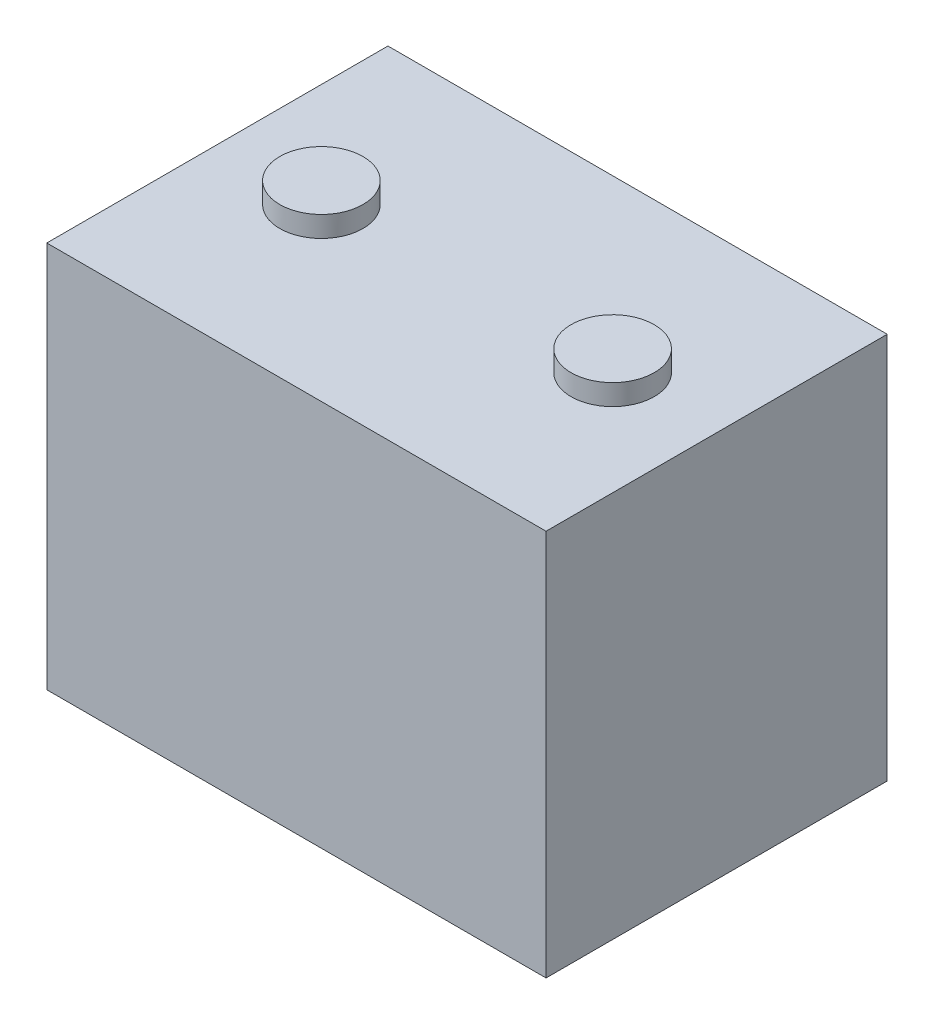
ISO-10303-21;
HEADER;
FILE_DESCRIPTION(('STEP AP214'),'2;1');
FILE_NAME('part.step','',(''),(''),'','','');
FILE_SCHEMA(('AUTOMOTIVE_DESIGN { 1 0 10303 214 1 1 1 1 }'));
ENDSEC;
DATA;
#1=APPLICATION_CONTEXT('core data for automotive mechanical design processes');
#2=APPLICATION_PROTOCOL_DEFINITION('international standard','automotive_design',2000,#1);
#3=PRODUCT_CONTEXT('',#1,'mechanical');
#4=PRODUCT('Part','Part','',(#3));
#5=PRODUCT_RELATED_PRODUCT_CATEGORY('part','',(#4));
#6=PRODUCT_DEFINITION_FORMATION('','',#4);
#7=PRODUCT_DEFINITION_CONTEXT('part definition',#1,'design');
#8=PRODUCT_DEFINITION('design','',#6,#7);
#9=PRODUCT_DEFINITION_SHAPE('','',#8);
#10=(LENGTH_UNIT() NAMED_UNIT(*) SI_UNIT(.MILLI.,.METRE.));
#11=(NAMED_UNIT(*) PLANE_ANGLE_UNIT() SI_UNIT($,.RADIAN.));
#12=(NAMED_UNIT(*) SI_UNIT($,.STERADIAN.) SOLID_ANGLE_UNIT());
#13=UNCERTAINTY_MEASURE_WITH_UNIT(LENGTH_MEASURE(1.E-05),#10,'distance_accuracy_value','');
#14=(GEOMETRIC_REPRESENTATION_CONTEXT(3) GLOBAL_UNCERTAINTY_ASSIGNED_CONTEXT((#13)) GLOBAL_UNIT_ASSIGNED_CONTEXT((#10,
#11,#12)) REPRESENTATION_CONTEXT('',''));
#15=CARTESIAN_POINT('',(0.,0.,0.));
#16=DIRECTION('',(0.,0.,1.));
#17=DIRECTION('',(1.,0.,0.));
#18=AXIS2_PLACEMENT_3D('',#15,#16,#17);
#19=CARTESIAN_POINT('',(32.4166666666667,66.75,82.));
#20=DIRECTION('',(-1.,0.,0.));
#21=DIRECTION('',(0.,-1.,0.));
#22=AXIS2_PLACEMENT_3D('',#19,#20,#21);
#23=PLANE('',#22);
#24=DIRECTION('',(0.,1.,0.));
#25=VECTOR('',#24,1.);
#26=CARTESIAN_POINT('',(32.4166666666667,66.75,0.));
#27=LINE('',#26,#25);
#28=CARTESIAN_POINT('',(32.4166666666667,-26.25,0.));
#29=VERTEX_POINT('',#28);
#30=CARTESIAN_POINT('',(32.4166666666667,66.75,0.));
#31=VERTEX_POINT('',#30);
#32=EDGE_CURVE('E100',#29,#31,#27,.T.);
#33=ORIENTED_EDGE('',*,*,#32,.T.);
#34=DIRECTION('',(0.,0.,-1.));
#35=VECTOR('',#34,1.);
#36=CARTESIAN_POINT('',(32.4166666666667,66.75,82.));
#37=LINE('',#36,#35);
#38=CARTESIAN_POINT('',(32.4166666666667,66.75,82.));
#39=VERTEX_POINT('',#38);
#40=EDGE_CURVE('E91',#39,#31,#37,.T.);
#41=ORIENTED_EDGE('',*,*,#40,.F.);
#42=DIRECTION('',(0.,1.,0.));
#43=VECTOR('',#42,1.);
#44=CARTESIAN_POINT('',(32.4166666666667,66.75,82.));
#45=LINE('',#44,#43);
#46=CARTESIAN_POINT('',(32.4166666666667,-26.25,82.));
#47=VERTEX_POINT('',#46);
#48=EDGE_CURVE('E85',#47,#39,#45,.T.);
#49=ORIENTED_EDGE('',*,*,#48,.F.);
#50=DIRECTION('',(0.,0.,-1.));
#51=VECTOR('',#50,1.);
#52=CARTESIAN_POINT('',(32.4166666666667,-26.25,82.));
#53=LINE('',#52,#51);
#54=EDGE_CURVE('E96',#47,#29,#53,.T.);
#55=ORIENTED_EDGE('',*,*,#54,.T.);
#56=EDGE_LOOP('',(#33,#41,#49,#55));
#57=FACE_BOUND('',#56,.T.);
#58=ADVANCED_FACE('F33',(#57),#23,.F.);
#59=CARTESIAN_POINT('',(-87.5833333333333,66.75,82.));
#60=DIRECTION('',(0.,-1.,0.));
#61=DIRECTION('',(0.,0.,-1.));
#62=AXIS2_PLACEMENT_3D('',#59,#60,#61);
#63=PLANE('',#62);
#64=CARTESIAN_POINT('',(7.4166666666667,66.75,41.));
#65=DIRECTION('',(0.,-1.,0.));
#66=DIRECTION('',(0.,0.,-1.));
#67=AXIS2_PLACEMENT_3D('',#64,#65,#66);
#68=CIRCLE('',#67,10.);
#69=CARTESIAN_POINT('',(7.4166666666667,66.75,31.));
#70=VERTEX_POINT('',#69);
#71=EDGE_CURVE('E11',#70,#70,#68,.F.);
#72=ORIENTED_EDGE('',*,*,#71,.F.);
#73=EDGE_LOOP('',(#72));
#74=FACE_BOUND('',#73,.T.);
#75=CARTESIAN_POINT('',(-62.5833333333333,66.75,41.));
#76=DIRECTION('',(0.,-1.,0.));
#77=DIRECTION('',(0.,0.,-1.));
#78=AXIS2_PLACEMENT_3D('',#75,#76,#77);
#79=CIRCLE('',#78,10.);
#80=CARTESIAN_POINT('',(-62.5833333333333,66.75,31.));
#81=VERTEX_POINT('',#80);
#82=EDGE_CURVE('E41',#81,#81,#79,.F.);
#83=ORIENTED_EDGE('',*,*,#82,.F.);
#84=EDGE_LOOP('',(#83));
#85=FACE_BOUND('',#84,.T.);
#86=DIRECTION('',(-1.,0.,0.));
#87=VECTOR('',#86,1.);
#88=CARTESIAN_POINT('',(-87.5833333333333,66.75,0.));
#89=LINE('',#88,#87);
#90=CARTESIAN_POINT('',(-87.5833333333333,66.75,0.));
#91=VERTEX_POINT('',#90);
#92=EDGE_CURVE('E90',#31,#91,#89,.T.);
#93=ORIENTED_EDGE('',*,*,#92,.T.);
#94=DIRECTION('',(0.,0.,-1.));
#95=VECTOR('',#94,1.);
#96=CARTESIAN_POINT('',(-87.5833333333333,66.75,82.));
#97=LINE('',#96,#95);
#98=CARTESIAN_POINT('',(-87.5833333333333,66.75,82.));
#99=VERTEX_POINT('',#98);
#100=EDGE_CURVE('E88',#99,#91,#97,.T.);
#101=ORIENTED_EDGE('',*,*,#100,.F.);
#102=DIRECTION('',(-1.,0.,0.));
#103=VECTOR('',#102,1.);
#104=CARTESIAN_POINT('',(-87.5833333333333,66.75,82.));
#105=LINE('',#104,#103);
#106=EDGE_CURVE('E80',#39,#99,#105,.T.);
#107=ORIENTED_EDGE('',*,*,#106,.F.);
#108=ORIENTED_EDGE('',*,*,#40,.T.);
#109=EDGE_LOOP('',(#93,#101,#107,#108));
#110=FACE_BOUND('',#109,.T.);
#111=ADVANCED_FACE('F89',(#74,#85,#110),#63,.F.);
#112=CARTESIAN_POINT('',(-87.5833333333333,66.75,82.));
#113=DIRECTION('',(1.,0.,0.));
#114=DIRECTION('',(0.,1.,0.));
#115=AXIS2_PLACEMENT_3D('',#112,#113,#114);
#116=PLANE('',#115);
#117=DIRECTION('',(0.,-1.,0.));
#118=VECTOR('',#117,1.);
#119=CARTESIAN_POINT('',(-87.5833333333333,66.75,0.));
#120=LINE('',#119,#118);
#121=CARTESIAN_POINT('',(-87.5833333333333,-26.25,0.));
#122=VERTEX_POINT('',#121);
#123=EDGE_CURVE('E66',#91,#122,#120,.T.);
#124=ORIENTED_EDGE('',*,*,#123,.T.);
#125=DIRECTION('',(0.,0.,-1.));
#126=VECTOR('',#125,1.);
#127=CARTESIAN_POINT('',(-87.5833333333333,-26.25,82.));
#128=LINE('',#127,#126);
#129=CARTESIAN_POINT('',(-87.5833333333333,-26.25,82.));
#130=VERTEX_POINT('',#129);
#131=EDGE_CURVE('E92',#130,#122,#128,.T.);
#132=ORIENTED_EDGE('',*,*,#131,.F.);
#133=DIRECTION('',(0.,-1.,0.));
#134=VECTOR('',#133,1.);
#135=CARTESIAN_POINT('',(-87.5833333333333,66.75,82.));
#136=LINE('',#135,#134);
#137=EDGE_CURVE('E83',#99,#130,#136,.T.);
#138=ORIENTED_EDGE('',*,*,#137,.F.);
#139=ORIENTED_EDGE('',*,*,#100,.T.);
#140=EDGE_LOOP('',(#124,#132,#138,#139));
#141=FACE_BOUND('',#140,.T.);
#142=ADVANCED_FACE('F94',(#141),#116,.F.);
#143=CARTESIAN_POINT('',(-87.5833333333333,-26.25,82.));
#144=DIRECTION('',(0.,1.,0.));
#145=DIRECTION('',(0.,0.,1.));
#146=AXIS2_PLACEMENT_3D('',#143,#144,#145);
#147=PLANE('',#146);
#148=DIRECTION('',(1.,0.,0.));
#149=VECTOR('',#148,1.);
#150=CARTESIAN_POINT('',(-87.5833333333333,-26.25,0.));
#151=LINE('',#150,#149);
#152=EDGE_CURVE('E72',#122,#29,#151,.T.);
#153=ORIENTED_EDGE('',*,*,#152,.T.);
#154=ORIENTED_EDGE('',*,*,#54,.F.);
#155=DIRECTION('',(1.,0.,0.));
#156=VECTOR('',#155,1.);
#157=CARTESIAN_POINT('',(-87.5833333333333,-26.25,82.));
#158=LINE('',#157,#156);
#159=EDGE_CURVE('E49',#130,#47,#158,.T.);
#160=ORIENTED_EDGE('',*,*,#159,.F.);
#161=ORIENTED_EDGE('',*,*,#131,.T.);
#162=EDGE_LOOP('',(#153,#154,#160,#161));
#163=FACE_BOUND('',#162,.T.);
#164=ADVANCED_FACE('F120',(#163),#147,.F.);
#165=CARTESIAN_POINT('',(0.,0.,82.));
#166=DIRECTION('',(0.,0.,1.));
#167=DIRECTION('',(1.,0.,0.));
#168=AXIS2_PLACEMENT_3D('',#165,#166,#167);
#169=PLANE('',#168);
#170=ORIENTED_EDGE('',*,*,#48,.T.);
#171=ORIENTED_EDGE('',*,*,#106,.T.);
#172=ORIENTED_EDGE('',*,*,#137,.T.);
#173=ORIENTED_EDGE('',*,*,#159,.T.);
#174=EDGE_LOOP('',(#170,#171,#172,#173));
#175=FACE_BOUND('',#174,.T.);
#176=ADVANCED_FACE('F81',(#175),#169,.T.);
#177=CARTESIAN_POINT('',(0.,0.,0.));
#178=DIRECTION('',(0.,0.,1.));
#179=DIRECTION('',(1.,0.,0.));
#180=AXIS2_PLACEMENT_3D('',#177,#178,#179);
#181=PLANE('',#180);
#182=ORIENTED_EDGE('',*,*,#32,.F.);
#183=ORIENTED_EDGE('',*,*,#152,.F.);
#184=ORIENTED_EDGE('',*,*,#123,.F.);
#185=ORIENTED_EDGE('',*,*,#92,.F.);
#186=EDGE_LOOP('',(#182,#183,#184,#185));
#187=FACE_BOUND('',#186,.T.);
#188=ADVANCED_FACE('F127',(#187),#181,.F.);
#189=CARTESIAN_POINT('',(-62.5833333333333,71.75,41.));
#190=DIRECTION('',(0.,-1.,0.));
#191=DIRECTION('',(0.,0.,-1.));
#192=AXIS2_PLACEMENT_3D('',#189,#190,#191);
#193=CYLINDRICAL_SURFACE('',#192,10.);
#194=CARTESIAN_POINT('',(-62.5833333333333,71.75,41.));
#195=DIRECTION('',(0.,1.,0.));
#196=DIRECTION('',(0.,0.,1.));
#197=AXIS2_PLACEMENT_3D('',#194,#195,#196);
#198=CIRCLE('',#197,10.);
#199=CARTESIAN_POINT('',(-62.5833333333333,71.75,51.));
#200=VERTEX_POINT('',#199);
#201=EDGE_CURVE('E103',#200,#200,#198,.T.);
#202=ORIENTED_EDGE('',*,*,#201,.F.);
#203=EDGE_LOOP('',(#202));
#204=FACE_BOUND('',#203,.T.);
#205=ORIENTED_EDGE('',*,*,#82,.T.);
#206=EDGE_LOOP('',(#205));
#207=FACE_BOUND('',#206,.T.);
#208=ADVANCED_FACE('F112',(#204,#207),#193,.T.);
#209=CARTESIAN_POINT('',(-62.5833333333333,71.75,41.));
#210=DIRECTION('',(0.,1.,0.));
#211=DIRECTION('',(0.,0.,1.));
#212=AXIS2_PLACEMENT_3D('',#209,#210,#211);
#213=PLANE('',#212);
#214=ORIENTED_EDGE('',*,*,#201,.T.);
#215=EDGE_LOOP('',(#214));
#216=FACE_BOUND('',#215,.T.);
#217=ADVANCED_FACE('F135',(#216),#213,.T.);
#218=CARTESIAN_POINT('',(7.4166666666667,71.75,41.));
#219=DIRECTION('',(0.,-1.,0.));
#220=DIRECTION('',(0.,0.,-1.));
#221=AXIS2_PLACEMENT_3D('',#218,#219,#220);
#222=CYLINDRICAL_SURFACE('',#221,10.);
#223=CARTESIAN_POINT('',(7.4166666666667,71.75,41.));
#224=DIRECTION('',(0.,1.,0.));
#225=DIRECTION('',(0.,0.,-1.));
#226=AXIS2_PLACEMENT_3D('',#223,#224,#225);
#227=CIRCLE('',#226,10.);
#228=CARTESIAN_POINT('',(7.4166666666667,71.75,31.));
#229=VERTEX_POINT('',#228);
#230=EDGE_CURVE('E151',#229,#229,#227,.T.);
#231=ORIENTED_EDGE('',*,*,#230,.F.);
#232=EDGE_LOOP('',(#231));
#233=FACE_BOUND('',#232,.T.);
#234=ORIENTED_EDGE('',*,*,#71,.T.);
#235=EDGE_LOOP('',(#234));
#236=FACE_BOUND('',#235,.T.);
#237=ADVANCED_FACE('F139',(#233,#236),#222,.T.);
#238=CARTESIAN_POINT('',(7.4166666666667,71.75,41.));
#239=DIRECTION('',(0.,-1.,0.));
#240=DIRECTION('',(0.,0.,-1.));
#241=AXIS2_PLACEMENT_3D('',#238,#239,#240);
#242=PLANE('',#241);
#243=ORIENTED_EDGE('',*,*,#230,.T.);
#244=EDGE_LOOP('',(#243));
#245=FACE_BOUND('',#244,.T.);
#246=ADVANCED_FACE('F143',(#245),#242,.F.);
#247=CLOSED_SHELL('',(#58,#111,#142,#164,#176,#188,#208,#217,#237,#246));
#248=MANIFOLD_SOLID_BREP('B2',#247);
#249=ADVANCED_BREP_SHAPE_REPRESENTATION('',(#18,#248),#14);
#250=SHAPE_DEFINITION_REPRESENTATION(#9,#249);
ENDSEC;
END-ISO-10303-21;
